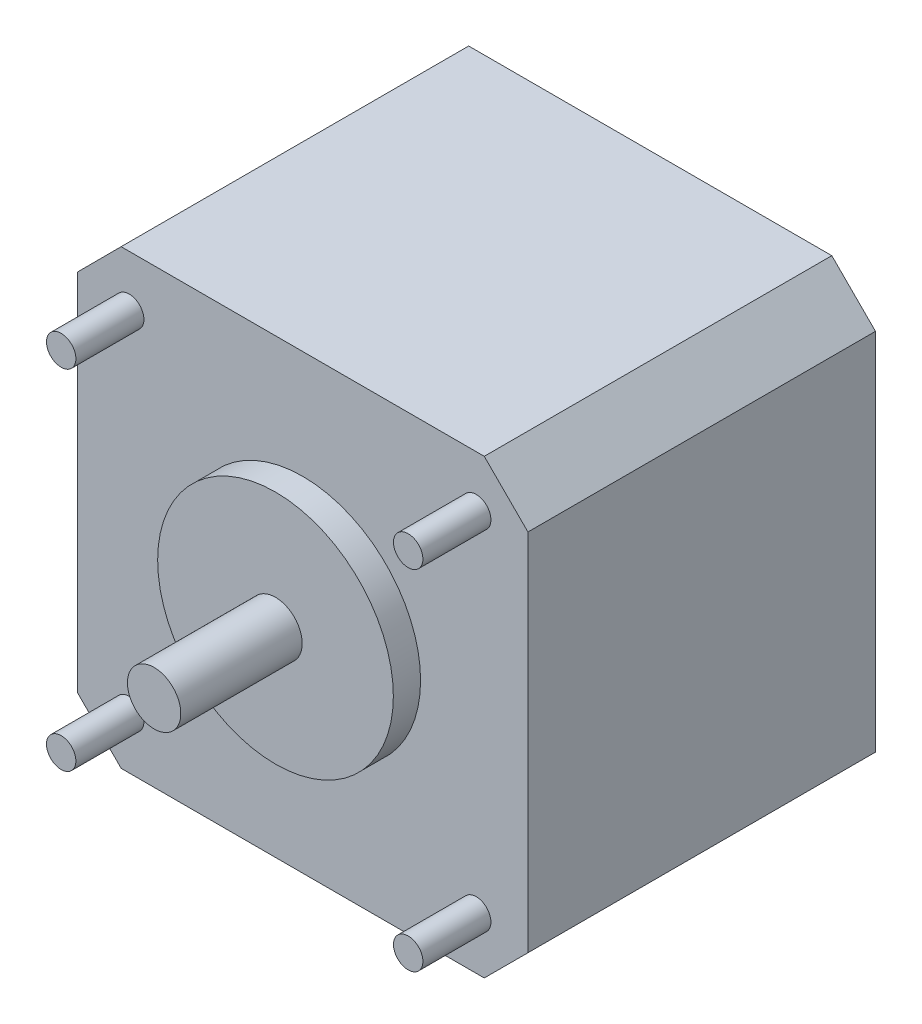
ISO-10303-21;
HEADER;
FILE_DESCRIPTION(('STEP AP214'),'2;1');
FILE_NAME('part.step','',(''),(''),'','','');
FILE_SCHEMA(('AUTOMOTIVE_DESIGN { 1 0 10303 214 1 1 1 1 }'));
ENDSEC;
DATA;
#1=APPLICATION_CONTEXT('core data for automotive mechanical design processes');
#2=APPLICATION_PROTOCOL_DEFINITION('international standard','automotive_design',2000,#1);
#3=PRODUCT_CONTEXT('',#1,'mechanical');
#4=PRODUCT('Part','Part','',(#3));
#5=PRODUCT_RELATED_PRODUCT_CATEGORY('part','',(#4));
#6=PRODUCT_DEFINITION_FORMATION('','',#4);
#7=PRODUCT_DEFINITION_CONTEXT('part definition',#1,'design');
#8=PRODUCT_DEFINITION('design','',#6,#7);
#9=PRODUCT_DEFINITION_SHAPE('','',#8);
#10=(LENGTH_UNIT() NAMED_UNIT(*) SI_UNIT(.MILLI.,.METRE.));
#11=(NAMED_UNIT(*) PLANE_ANGLE_UNIT() SI_UNIT($,.RADIAN.));
#12=(NAMED_UNIT(*) SI_UNIT($,.STERADIAN.) SOLID_ANGLE_UNIT());
#13=UNCERTAINTY_MEASURE_WITH_UNIT(LENGTH_MEASURE(1.E-05),#10,'distance_accuracy_value','');
#14=(GEOMETRIC_REPRESENTATION_CONTEXT(3) GLOBAL_UNCERTAINTY_ASSIGNED_CONTEXT((#13)) GLOBAL_UNIT_ASSIGNED_CONTEXT((#10,
#11,#12)) REPRESENTATION_CONTEXT('',''));
#15=CARTESIAN_POINT('',(0.,0.,0.));
#16=DIRECTION('',(0.,0.,1.));
#17=DIRECTION('',(1.,0.,0.));
#18=AXIS2_PLACEMENT_3D('',#15,#16,#17);
#19=CARTESIAN_POINT('',(0.,0.,0.));
#20=DIRECTION('',(0.,0.,1.));
#21=DIRECTION('',(1.,0.,0.));
#22=AXIS2_PLACEMENT_3D('',#19,#20,#21);
#23=PLANE('',#22);
#24=DIRECTION('',(0.707106781186546,-0.707106781186549,0.));
#25=VECTOR('',#24,1.);
#26=CARTESIAN_POINT('',(40.0619818605174,40.0619818605172,0.));
#27=LINE('',#26,#25);
#28=CARTESIAN_POINT('',(37.9599637210346,42.164,0.));
#29=VERTEX_POINT('',#28);
#30=CARTESIAN_POINT('',(42.037,38.0869637210346,0.));
#31=VERTEX_POINT('',#30);
#32=EDGE_CURVE('E128',#29,#31,#27,.T.);
#33=ORIENTED_EDGE('',*,*,#32,.T.);
#34=DIRECTION('',(0.,1.,0.));
#35=VECTOR('',#34,1.);
#36=CARTESIAN_POINT('',(42.037,0.,0.));
#37=LINE('',#36,#35);
#38=CARTESIAN_POINT('',(42.037,4.07703627896541,0.));
#39=VERTEX_POINT('',#38);
#40=EDGE_CURVE('E146',#39,#31,#37,.T.);
#41=ORIENTED_EDGE('',*,*,#40,.F.);
#42=DIRECTION('',(0.707106781186546,0.707106781186549,0.));
#43=VECTOR('',#42,1.);
#44=CARTESIAN_POINT('',(18.9799818605174,-18.9799818605173,0.));
#45=LINE('',#44,#43);
#46=CARTESIAN_POINT('',(37.9599637210346,0.,0.));
#47=VERTEX_POINT('',#46);
#48=EDGE_CURVE('E79',#47,#39,#45,.T.);
#49=ORIENTED_EDGE('',*,*,#48,.F.);
#50=DIRECTION('',(1.,0.,0.));
#51=VECTOR('',#50,1.);
#52=CARTESIAN_POINT('',(0.,0.,0.));
#53=LINE('',#52,#51);
#54=CARTESIAN_POINT('',(4.07703627896542,0.,0.));
#55=VERTEX_POINT('',#54);
#56=EDGE_CURVE('E119',#55,#47,#53,.T.);
#57=ORIENTED_EDGE('',*,*,#56,.F.);
#58=DIRECTION('',(-0.707106781186551,0.707106781186544,0.));
#59=VECTOR('',#58,1.);
#60=CARTESIAN_POINT('',(2.03851813948269,2.03851813948271,0.));
#61=LINE('',#60,#59);
#62=CARTESIAN_POINT('',(0.,4.07703627896537,0.));
#63=VERTEX_POINT('',#62);
#64=EDGE_CURVE('E141',#55,#63,#61,.T.);
#65=ORIENTED_EDGE('',*,*,#64,.T.);
#66=DIRECTION('',(0.,1.,0.));
#67=VECTOR('',#66,1.);
#68=CARTESIAN_POINT('',(0.,0.,0.));
#69=LINE('',#68,#67);
#70=CARTESIAN_POINT('',(0.,38.0808189895735,0.));
#71=VERTEX_POINT('',#70);
#72=EDGE_CURVE('E138',#63,#71,#69,.T.);
#73=ORIENTED_EDGE('',*,*,#72,.T.);
#74=DIRECTION('',(0.70603945201763,0.708172501721611,0.));
#75=VECTOR('',#74,1.);
#76=CARTESIAN_POINT('',(-19.0403228628078,18.9829724927391,0.));
#77=LINE('',#76,#75);
#78=CARTESIAN_POINT('',(4.07088227244324,42.164,0.));
#79=VERTEX_POINT('',#78);
#80=EDGE_CURVE('E135',#71,#79,#77,.T.);
#81=ORIENTED_EDGE('',*,*,#80,.T.);
#82=DIRECTION('',(1.,0.,0.));
#83=VECTOR('',#82,1.);
#84=CARTESIAN_POINT('',(0.,42.164,0.));
#85=LINE('',#84,#83);
#86=EDGE_CURVE('E131',#79,#29,#85,.T.);
#87=ORIENTED_EDGE('',*,*,#86,.T.);
#88=EDGE_LOOP('',(#33,#41,#49,#57,#65,#73,#81,#87));
#89=FACE_BOUND('',#88,.T.);
#90=CARTESIAN_POINT('',(21.0185,21.0789276342695,0.));
#91=DIRECTION('',(0.,0.,1.));
#92=DIRECTION('',(1.,0.,0.));
#93=AXIS2_PLACEMENT_3D('',#90,#91,#92);
#94=CIRCLE('',#93,2.4892);
#95=CARTESIAN_POINT('',(23.5077,21.0789276342695,0.));
#96=VERTEX_POINT('',#95);
#97=EDGE_CURVE('E11',#96,#96,#94,.F.);
#98=ORIENTED_EDGE('',*,*,#97,.F.);
#99=EDGE_LOOP('',(#98));
#100=FACE_BOUND('',#99,.T.);
#101=ADVANCED_FACE('F33',(#89,#100),#23,.F.);
#102=CARTESIAN_POINT('',(0.,0.,32.4358));
#103=DIRECTION('',(0.,0.,1.));
#104=DIRECTION('',(1.,0.,0.));
#105=AXIS2_PLACEMENT_3D('',#102,#103,#104);
#106=PLANE('',#105);
#107=CARTESIAN_POINT('',(37.211,4.826,32.4358));
#108=DIRECTION('',(0.,0.,1.));
#109=DIRECTION('',(1.,0.,0.));
#110=AXIS2_PLACEMENT_3D('',#107,#108,#109);
#111=CIRCLE('',#110,1.3716);
#112=CARTESIAN_POINT('',(38.5826,4.826,32.4358));
#113=VERTEX_POINT('',#112);
#114=EDGE_CURVE('E269',#113,#113,#111,.T.);
#115=ORIENTED_EDGE('',*,*,#114,.F.);
#116=EDGE_LOOP('',(#115));
#117=FACE_BOUND('',#116,.T.);
#118=CARTESIAN_POINT('',(4.826,37.338,32.4358));
#119=DIRECTION('',(0.,0.,1.));
#120=DIRECTION('',(1.,0.,0.));
#121=AXIS2_PLACEMENT_3D('',#118,#119,#120);
#122=CIRCLE('',#121,1.3716);
#123=CARTESIAN_POINT('',(6.1976,37.338,32.4358));
#124=VERTEX_POINT('',#123);
#125=EDGE_CURVE('E280',#124,#124,#122,.T.);
#126=ORIENTED_EDGE('',*,*,#125,.F.);
#127=EDGE_LOOP('',(#126));
#128=FACE_BOUND('',#127,.T.);
#129=DIRECTION('',(0.707106781186546,-0.707106781186549,0.));
#130=VECTOR('',#129,1.);
#131=CARTESIAN_POINT('',(40.0619818605174,40.0619818605172,32.4358));
#132=LINE('',#131,#130);
#133=CARTESIAN_POINT('',(37.9599637210346,42.164,32.4358));
#134=VERTEX_POINT('',#133);
#135=CARTESIAN_POINT('',(42.037,38.0869637210346,32.4358));
#136=VERTEX_POINT('',#135);
#137=EDGE_CURVE('E148',#134,#136,#132,.T.);
#138=ORIENTED_EDGE('',*,*,#137,.F.);
#139=DIRECTION('',(1.,0.,0.));
#140=VECTOR('',#139,1.);
#141=CARTESIAN_POINT('',(0.,42.164,32.4358));
#142=LINE('',#141,#140);
#143=CARTESIAN_POINT('',(4.07088227244324,42.164,32.4358));
#144=VERTEX_POINT('',#143);
#145=EDGE_CURVE('E162',#144,#134,#142,.T.);
#146=ORIENTED_EDGE('',*,*,#145,.F.);
#147=DIRECTION('',(0.70603945201763,0.708172501721611,0.));
#148=VECTOR('',#147,1.);
#149=CARTESIAN_POINT('',(-19.0403228628078,18.9829724927391,32.4358));
#150=LINE('',#149,#148);
#151=CARTESIAN_POINT('',(0.,38.0808189895735,32.4358));
#152=VERTEX_POINT('',#151);
#153=EDGE_CURVE('E172',#152,#144,#150,.T.);
#154=ORIENTED_EDGE('',*,*,#153,.F.);
#155=DIRECTION('',(0.,1.,0.));
#156=VECTOR('',#155,1.);
#157=CARTESIAN_POINT('',(0.,0.,32.4358));
#158=LINE('',#157,#156);
#159=CARTESIAN_POINT('',(0.,4.07703627896537,32.4358));
#160=VERTEX_POINT('',#159);
#161=EDGE_CURVE('E175',#160,#152,#158,.T.);
#162=ORIENTED_EDGE('',*,*,#161,.F.);
#163=DIRECTION('',(-0.707106781186551,0.707106781186544,0.));
#164=VECTOR('',#163,1.);
#165=CARTESIAN_POINT('',(2.03851813948269,2.03851813948271,32.4358));
#166=LINE('',#165,#164);
#167=CARTESIAN_POINT('',(4.07703627896542,0.,32.4358));
#168=VERTEX_POINT('',#167);
#169=EDGE_CURVE('E113',#168,#160,#166,.T.);
#170=ORIENTED_EDGE('',*,*,#169,.F.);
#171=DIRECTION('',(1.,0.,0.));
#172=VECTOR('',#171,1.);
#173=CARTESIAN_POINT('',(0.,0.,32.4358));
#174=LINE('',#173,#172);
#175=CARTESIAN_POINT('',(37.9599637210346,0.,32.4358));
#176=VERTEX_POINT('',#175);
#177=EDGE_CURVE('E105',#168,#176,#174,.T.);
#178=ORIENTED_EDGE('',*,*,#177,.T.);
#179=DIRECTION('',(0.707106781186546,0.707106781186549,0.));
#180=VECTOR('',#179,1.);
#181=CARTESIAN_POINT('',(18.9799818605174,-18.9799818605173,32.4358));
#182=LINE('',#181,#180);
#183=CARTESIAN_POINT('',(42.037,4.07703627896541,32.4358));
#184=VERTEX_POINT('',#183);
#185=EDGE_CURVE('E110',#176,#184,#182,.T.);
#186=ORIENTED_EDGE('',*,*,#185,.T.);
#187=DIRECTION('',(0.,1.,0.));
#188=VECTOR('',#187,1.);
#189=CARTESIAN_POINT('',(42.037,0.,32.4358));
#190=LINE('',#189,#188);
#191=EDGE_CURVE('E50',#184,#136,#190,.T.);
#192=ORIENTED_EDGE('',*,*,#191,.T.);
#193=EDGE_LOOP('',(#138,#146,#154,#162,#170,#178,#186,#192));
#194=FACE_BOUND('',#193,.T.);
#195=CARTESIAN_POINT('',(21.0185,21.0789276342695,32.4358));
#196=DIRECTION('',(0.,0.,1.));
#197=DIRECTION('',(1.,0.,0.));
#198=AXIS2_PLACEMENT_3D('',#195,#196,#197);
#199=CIRCLE('',#198,10.9982);
#200=CARTESIAN_POINT('',(32.0167,21.0789276342695,32.4358));
#201=VERTEX_POINT('',#200);
#202=EDGE_CURVE('E292',#201,#201,#199,.T.);
#203=ORIENTED_EDGE('',*,*,#202,.F.);
#204=EDGE_LOOP('',(#203));
#205=FACE_BOUND('',#204,.T.);
#206=CARTESIAN_POINT('',(4.826,4.826,32.4358));
#207=DIRECTION('',(0.,0.,1.));
#208=DIRECTION('',(1.,0.,0.));
#209=AXIS2_PLACEMENT_3D('',#206,#207,#208);
#210=CIRCLE('',#209,1.3716);
#211=CARTESIAN_POINT('',(6.1976,4.826,32.4358));
#212=VERTEX_POINT('',#211);
#213=EDGE_CURVE('E274',#212,#212,#210,.T.);
#214=ORIENTED_EDGE('',*,*,#213,.F.);
#215=EDGE_LOOP('',(#214));
#216=FACE_BOUND('',#215,.T.);
#217=CARTESIAN_POINT('',(37.211,37.338,32.4358));
#218=DIRECTION('',(0.,0.,1.));
#219=DIRECTION('',(1.,0.,0.));
#220=AXIS2_PLACEMENT_3D('',#217,#218,#219);
#221=CIRCLE('',#220,1.3716);
#222=CARTESIAN_POINT('',(38.5826,37.338,32.4358));
#223=VERTEX_POINT('',#222);
#224=EDGE_CURVE('E262',#223,#223,#221,.T.);
#225=ORIENTED_EDGE('',*,*,#224,.F.);
#226=EDGE_LOOP('',(#225));
#227=FACE_BOUND('',#226,.T.);
#228=ADVANCED_FACE('F107',(#117,#128,#194,#205,#216,#227),#106,.T.);
#229=CARTESIAN_POINT('',(21.0185,21.0789276342695,34.9758));
#230=DIRECTION('',(0.,0.,1.));
#231=DIRECTION('',(1.,0.,0.));
#232=AXIS2_PLACEMENT_3D('',#229,#230,#231);
#233=PLANE('',#232);
#234=CARTESIAN_POINT('',(21.0185,21.0789276342695,34.9758));
#235=DIRECTION('',(0.,0.,1.));
#236=DIRECTION('',(1.,0.,0.));
#237=AXIS2_PLACEMENT_3D('',#234,#235,#236);
#238=CIRCLE('',#237,10.9982);
#239=CARTESIAN_POINT('',(32.0167,21.0789276342695,34.9758));
#240=VERTEX_POINT('',#239);
#241=EDGE_CURVE('E132',#240,#240,#238,.T.);
#242=ORIENTED_EDGE('',*,*,#241,.T.);
#243=EDGE_LOOP('',(#242));
#244=FACE_BOUND('',#243,.T.);
#245=CARTESIAN_POINT('',(21.0185,21.0789276342695,34.9758));
#246=DIRECTION('',(0.,0.,1.));
#247=DIRECTION('',(1.,0.,0.));
#248=AXIS2_PLACEMENT_3D('',#245,#246,#247);
#249=CIRCLE('',#248,2.4892);
#250=CARTESIAN_POINT('',(18.5293,21.0789276342695,34.9758));
#251=VERTEX_POINT('',#250);
#252=EDGE_CURVE('E286',#251,#251,#249,.T.);
#253=ORIENTED_EDGE('',*,*,#252,.F.);
#254=EDGE_LOOP('',(#253));
#255=FACE_BOUND('',#254,.T.);
#256=ADVANCED_FACE('F204',(#244,#255),#233,.T.);
#257=CARTESIAN_POINT('',(40.0619818605174,40.0619818605172,32.4358));
#258=DIRECTION('',(0.707106781186549,0.707106781186546,0.));
#259=DIRECTION('',(-0.707106781186546,0.707106781186549,0.));
#260=AXIS2_PLACEMENT_3D('',#257,#258,#259);
#261=PLANE('',#260);
#262=ORIENTED_EDGE('',*,*,#32,.F.);
#263=DIRECTION('',(0.,0.,-1.));
#264=VECTOR('',#263,1.);
#265=CARTESIAN_POINT('',(37.9599637210346,42.164,32.4358));
#266=LINE('',#265,#264);
#267=EDGE_CURVE('E42',#134,#29,#266,.T.);
#268=ORIENTED_EDGE('',*,*,#267,.F.);
#269=ORIENTED_EDGE('',*,*,#137,.T.);
#270=DIRECTION('',(0.,0.,-1.));
#271=VECTOR('',#270,1.);
#272=CARTESIAN_POINT('',(42.037,38.0869637210346,32.4358));
#273=LINE('',#272,#271);
#274=EDGE_CURVE('E86',#136,#31,#273,.T.);
#275=ORIENTED_EDGE('',*,*,#274,.T.);
#276=EDGE_LOOP('',(#262,#268,#269,#275));
#277=FACE_BOUND('',#276,.T.);
#278=ADVANCED_FACE('F35',(#277),#261,.T.);
#279=CARTESIAN_POINT('',(0.,42.164,32.4358));
#280=DIRECTION('',(0.,1.,0.));
#281=DIRECTION('',(0.,0.,1.));
#282=AXIS2_PLACEMENT_3D('',#279,#280,#281);
#283=PLANE('',#282);
#284=ORIENTED_EDGE('',*,*,#86,.F.);
#285=DIRECTION('',(0.,0.,-1.));
#286=VECTOR('',#285,1.);
#287=CARTESIAN_POINT('',(4.07088227244324,42.164,32.4358));
#288=LINE('',#287,#286);
#289=EDGE_CURVE('E156',#144,#79,#288,.T.);
#290=ORIENTED_EDGE('',*,*,#289,.F.);
#291=ORIENTED_EDGE('',*,*,#145,.T.);
#292=ORIENTED_EDGE('',*,*,#267,.T.);
#293=EDGE_LOOP('',(#284,#290,#291,#292));
#294=FACE_BOUND('',#293,.T.);
#295=ADVANCED_FACE('F160',(#294),#283,.T.);
#296=CARTESIAN_POINT('',(-19.0403228628078,18.9829724927391,32.4358));
#297=DIRECTION('',(-0.708172501721611,0.70603945201763,0.));
#298=DIRECTION('',(-0.70603945201763,-0.708172501721611,0.));
#299=AXIS2_PLACEMENT_3D('',#296,#297,#298);
#300=PLANE('',#299);
#301=ORIENTED_EDGE('',*,*,#80,.F.);
#302=DIRECTION('',(0.,0.,-1.));
#303=VECTOR('',#302,1.);
#304=CARTESIAN_POINT('',(0.,38.0808189895735,32.4358));
#305=LINE('',#304,#303);
#306=EDGE_CURVE('E154',#152,#71,#305,.T.);
#307=ORIENTED_EDGE('',*,*,#306,.F.);
#308=ORIENTED_EDGE('',*,*,#153,.T.);
#309=ORIENTED_EDGE('',*,*,#289,.T.);
#310=EDGE_LOOP('',(#301,#307,#308,#309));
#311=FACE_BOUND('',#310,.T.);
#312=ADVANCED_FACE('F169',(#311),#300,.T.);
#313=CARTESIAN_POINT('',(0.,0.,32.4358));
#314=DIRECTION('',(-1.,0.,0.));
#315=DIRECTION('',(0.,-1.,0.));
#316=AXIS2_PLACEMENT_3D('',#313,#314,#315);
#317=PLANE('',#316);
#318=ORIENTED_EDGE('',*,*,#72,.F.);
#319=DIRECTION('',(0.,0.,-1.));
#320=VECTOR('',#319,1.);
#321=CARTESIAN_POINT('',(0.,4.07703627896537,32.4358));
#322=LINE('',#321,#320);
#323=EDGE_CURVE('E152',#160,#63,#322,.T.);
#324=ORIENTED_EDGE('',*,*,#323,.F.);
#325=ORIENTED_EDGE('',*,*,#161,.T.);
#326=ORIENTED_EDGE('',*,*,#306,.T.);
#327=EDGE_LOOP('',(#318,#324,#325,#326));
#328=FACE_BOUND('',#327,.T.);
#329=ADVANCED_FACE('F428',(#328),#317,.T.);
#330=CARTESIAN_POINT('',(2.03851813948269,2.03851813948271,32.4358));
#331=DIRECTION('',(-0.707106781186544,-0.707106781186551,0.));
#332=DIRECTION('',(0.707106781186551,-0.707106781186544,0.));
#333=AXIS2_PLACEMENT_3D('',#330,#331,#332);
#334=PLANE('',#333);
#335=ORIENTED_EDGE('',*,*,#64,.F.);
#336=DIRECTION('',(0.,0.,-1.));
#337=VECTOR('',#336,1.);
#338=CARTESIAN_POINT('',(4.07703627896542,0.,32.4358));
#339=LINE('',#338,#337);
#340=EDGE_CURVE('E120',#168,#55,#339,.T.);
#341=ORIENTED_EDGE('',*,*,#340,.F.);
#342=ORIENTED_EDGE('',*,*,#169,.T.);
#343=ORIENTED_EDGE('',*,*,#323,.T.);
#344=EDGE_LOOP('',(#335,#341,#342,#343));
#345=FACE_BOUND('',#344,.T.);
#346=ADVANCED_FACE('F182',(#345),#334,.T.);
#347=CARTESIAN_POINT('',(0.,0.,32.4358));
#348=DIRECTION('',(0.,1.,0.));
#349=DIRECTION('',(0.,0.,1.));
#350=AXIS2_PLACEMENT_3D('',#347,#348,#349);
#351=PLANE('',#350);
#352=ORIENTED_EDGE('',*,*,#56,.T.);
#353=DIRECTION('',(0.,0.,-1.));
#354=VECTOR('',#353,1.);
#355=CARTESIAN_POINT('',(37.9599637210346,0.,32.4358));
#356=LINE('',#355,#354);
#357=EDGE_CURVE('E116',#176,#47,#356,.T.);
#358=ORIENTED_EDGE('',*,*,#357,.F.);
#359=ORIENTED_EDGE('',*,*,#177,.F.);
#360=ORIENTED_EDGE('',*,*,#340,.T.);
#361=EDGE_LOOP('',(#352,#358,#359,#360));
#362=FACE_BOUND('',#361,.T.);
#363=ADVANCED_FACE('F117',(#362),#351,.F.);
#364=CARTESIAN_POINT('',(18.9799818605174,-18.9799818605173,32.4358));
#365=DIRECTION('',(-0.707106781186549,0.707106781186546,0.));
#366=DIRECTION('',(-0.707106781186546,-0.707106781186549,0.));
#367=AXIS2_PLACEMENT_3D('',#364,#365,#366);
#368=PLANE('',#367);
#369=ORIENTED_EDGE('',*,*,#48,.T.);
#370=DIRECTION('',(0.,0.,-1.));
#371=VECTOR('',#370,1.);
#372=CARTESIAN_POINT('',(42.037,4.07703627896541,32.4358));
#373=LINE('',#372,#371);
#374=EDGE_CURVE('E121',#184,#39,#373,.T.);
#375=ORIENTED_EDGE('',*,*,#374,.F.);
#376=ORIENTED_EDGE('',*,*,#185,.F.);
#377=ORIENTED_EDGE('',*,*,#357,.T.);
#378=EDGE_LOOP('',(#369,#375,#376,#377));
#379=FACE_BOUND('',#378,.T.);
#380=ADVANCED_FACE('F123',(#379),#368,.F.);
#381=CARTESIAN_POINT('',(42.037,0.,32.4358));
#382=DIRECTION('',(-1.,0.,0.));
#383=DIRECTION('',(0.,-1.,0.));
#384=AXIS2_PLACEMENT_3D('',#381,#382,#383);
#385=PLANE('',#384);
#386=ORIENTED_EDGE('',*,*,#40,.T.);
#387=ORIENTED_EDGE('',*,*,#274,.F.);
#388=ORIENTED_EDGE('',*,*,#191,.F.);
#389=ORIENTED_EDGE('',*,*,#374,.T.);
#390=EDGE_LOOP('',(#386,#387,#388,#389));
#391=FACE_BOUND('',#390,.T.);
#392=ADVANCED_FACE('F184',(#391),#385,.F.);
#393=CARTESIAN_POINT('',(21.0185,21.0789276342695,34.9758));
#394=DIRECTION('',(0.,0.,-1.));
#395=DIRECTION('',(-1.,0.,0.));
#396=AXIS2_PLACEMENT_3D('',#393,#394,#395);
#397=CYLINDRICAL_SURFACE('',#396,10.9982);
#398=ORIENTED_EDGE('',*,*,#241,.F.);
#399=EDGE_LOOP('',(#398));
#400=FACE_BOUND('',#399,.T.);
#401=ORIENTED_EDGE('',*,*,#202,.T.);
#402=EDGE_LOOP('',(#401));
#403=FACE_BOUND('',#402,.T.);
#404=ADVANCED_FACE('F186',(#400,#403),#397,.T.);
#405=CARTESIAN_POINT('',(21.0185,21.0789276342695,46.3042));
#406=DIRECTION('',(0.,0.,-1.));
#407=DIRECTION('',(-1.,0.,0.));
#408=AXIS2_PLACEMENT_3D('',#405,#406,#407);
#409=CYLINDRICAL_SURFACE('',#408,2.4892);
#410=CARTESIAN_POINT('',(21.0185,21.0789276342695,46.3042));
#411=DIRECTION('',(0.,0.,1.));
#412=DIRECTION('',(1.,0.,0.));
#413=AXIS2_PLACEMENT_3D('',#410,#411,#412);
#414=CIRCLE('',#413,2.4892);
#415=CARTESIAN_POINT('',(18.5293,21.0789276342695,46.3042));
#416=VERTEX_POINT('',#415);
#417=EDGE_CURVE('E289',#416,#416,#414,.T.);
#418=CARTESIAN_POINT('',(18.5293,21.0789276342695,46.3042));
#419=CARTESIAN_POINT('',(18.5293,21.0789276342695,46.1861958333333));
#420=CARTESIAN_POINT('',(18.5293,21.0789276342695,46.0681916666667));
#421=CARTESIAN_POINT('',(18.5293,21.0789276342695,45.8321833333333));
#422=CARTESIAN_POINT('',(18.5293,21.0789276342695,45.7141791666667));
#423=CARTESIAN_POINT('',(18.5293,21.0789276342695,45.4781708333333));
#424=CARTESIAN_POINT('',(18.5293,21.0789276342695,45.3601666666667));
#425=CARTESIAN_POINT('',(18.5293,21.0789276342695,45.1241583333333));
#426=CARTESIAN_POINT('',(18.5293,21.0789276342695,45.0061541666667));
#427=CARTESIAN_POINT('',(18.5293,21.0789276342695,44.7701458333333));
#428=CARTESIAN_POINT('',(18.5293,21.0789276342695,44.6521416666667));
#429=CARTESIAN_POINT('',(18.5293,21.0789276342695,44.4161333333333));
#430=CARTESIAN_POINT('',(18.5293,21.0789276342695,44.2981291666667));
#431=CARTESIAN_POINT('',(18.5293,21.0789276342695,44.0621208333333));
#432=CARTESIAN_POINT('',(18.5293,21.0789276342695,43.9441166666667));
#433=CARTESIAN_POINT('',(18.5293,21.0789276342695,43.7081083333333));
#434=CARTESIAN_POINT('',(18.5293,21.0789276342695,43.5901041666667));
#435=CARTESIAN_POINT('',(18.5293,21.0789276342695,43.3540958333333));
#436=CARTESIAN_POINT('',(18.5293,21.0789276342695,43.2360916666667));
#437=CARTESIAN_POINT('',(18.5293,21.0789276342695,43.0000833333333));
#438=CARTESIAN_POINT('',(18.5293,21.0789276342695,42.8820791666667));
#439=CARTESIAN_POINT('',(18.5293,21.0789276342695,42.6460708333333));
#440=CARTESIAN_POINT('',(18.5293,21.0789276342695,42.5280666666667));
#441=CARTESIAN_POINT('',(18.5293,21.0789276342695,42.2920583333333));
#442=CARTESIAN_POINT('',(18.5293,21.0789276342695,42.1740541666667));
#443=CARTESIAN_POINT('',(18.5293,21.0789276342695,41.9380458333333));
#444=CARTESIAN_POINT('',(18.5293,21.0789276342695,41.8200416666667));
#445=CARTESIAN_POINT('',(18.5293,21.0789276342695,41.5840333333333));
#446=CARTESIAN_POINT('',(18.5293,21.0789276342695,41.4660291666667));
#447=CARTESIAN_POINT('',(18.5293,21.0789276342695,41.2300208333333));
#448=CARTESIAN_POINT('',(18.5293,21.0789276342695,41.1120166666667));
#449=CARTESIAN_POINT('',(18.5293,21.0789276342695,40.8760083333333));
#450=CARTESIAN_POINT('',(18.5293,21.0789276342695,40.7580041666667));
#451=CARTESIAN_POINT('',(18.5293,21.0789276342695,40.5219958333333));
#452=CARTESIAN_POINT('',(18.5293,21.0789276342695,40.4039916666667));
#453=CARTESIAN_POINT('',(18.5293,21.0789276342695,40.1679833333333));
#454=CARTESIAN_POINT('',(18.5293,21.0789276342695,40.0499791666667));
#455=CARTESIAN_POINT('',(18.5293,21.0789276342695,39.8139708333333));
#456=CARTESIAN_POINT('',(18.5293,21.0789276342695,39.6959666666667));
#457=CARTESIAN_POINT('',(18.5293,21.0789276342695,39.4599583333333));
#458=CARTESIAN_POINT('',(18.5293,21.0789276342695,39.3419541666667));
#459=CARTESIAN_POINT('',(18.5293,21.0789276342695,39.1059458333333));
#460=CARTESIAN_POINT('',(18.5293,21.0789276342695,38.9879416666667));
#461=CARTESIAN_POINT('',(18.5293,21.0789276342695,38.7519333333333));
#462=CARTESIAN_POINT('',(18.5293,21.0789276342695,38.6339291666667));
#463=CARTESIAN_POINT('',(18.5293,21.0789276342695,38.3979208333333));
#464=CARTESIAN_POINT('',(18.5293,21.0789276342695,38.2799166666667));
#465=CARTESIAN_POINT('',(18.5293,21.0789276342695,38.0439083333333));
#466=CARTESIAN_POINT('',(18.5293,21.0789276342695,37.9259041666667));
#467=CARTESIAN_POINT('',(18.5293,21.0789276342695,37.6898958333333));
#468=CARTESIAN_POINT('',(18.5293,21.0789276342695,37.5718916666667));
#469=CARTESIAN_POINT('',(18.5293,21.0789276342695,37.3358833333333));
#470=CARTESIAN_POINT('',(18.5293,21.0789276342695,37.2178791666667));
#471=CARTESIAN_POINT('',(18.5293,21.0789276342695,36.9818708333333));
#472=CARTESIAN_POINT('',(18.5293,21.0789276342695,36.8638666666667));
#473=CARTESIAN_POINT('',(18.5293,21.0789276342695,36.6278583333333));
#474=CARTESIAN_POINT('',(18.5293,21.0789276342695,36.5098541666667));
#475=CARTESIAN_POINT('',(18.5293,21.0789276342695,36.2738458333333));
#476=CARTESIAN_POINT('',(18.5293,21.0789276342695,36.1558416666667));
#477=CARTESIAN_POINT('',(18.5293,21.0789276342695,35.9198333333333));
#478=CARTESIAN_POINT('',(18.5293,21.0789276342695,35.8018291666667));
#479=CARTESIAN_POINT('',(18.5293,21.0789276342695,35.5658208333333));
#480=CARTESIAN_POINT('',(18.5293,21.0789276342695,35.4478166666667));
#481=CARTESIAN_POINT('',(18.5293,21.0789276342695,35.2118083333333));
#482=CARTESIAN_POINT('',(18.5293,21.0789276342695,35.0938041666667));
#483=CARTESIAN_POINT('',(18.5293,21.0789276342695,34.9758));
#484=B_SPLINE_CURVE_WITH_KNOTS('',3,(#418,#419,#420,#421,#422,#423,#424,#425,#426,#427,#428,
#429,#430,#431,#432,#433,#434,#435,#436,#437,#438,#439,#440,#441,#442,#443,#444,#445,#446,#447,
#448,#449,#450,#451,#452,#453,#454,#455,#456,#457,#458,#459,#460,#461,#462,#463,#464,#465,#466,
#467,#468,#469,#470,#471,#472,#473,#474,#475,#476,#477,#478,#479,#480,#481,#482,#483),
.UNSPECIFIED.,.F.,.F.,(4,2,2,2,2,2,2,2,2,2,2,2,2,2,2,2,2,2,2,2,2,2,2,2,2,2,2,2,2,2,2,2,4),(0.,
0.354012500000001,0.708025000000001,1.0620375,1.41605,1.7700625,2.124075,2.4780875,2.8321,
3.1861125,3.54012500000001,3.89413750000001,4.24815000000001,4.60216250000001,4.956175,
5.3101875,5.6642,6.0182125,6.372225,6.7262375,7.08025,7.4342625,7.788275,8.14228750000001,
8.49630000000001,8.85031250000001,9.20432500000001,9.55833750000001,9.91235000000001,10.2663625,
10.620375,10.9743875,11.3284),.UNSPECIFIED.);
#485=EDGE_CURVE('BSEAM193',#416,#251,#484,.T.);
#486=ORIENTED_EDGE('',*,*,#417,.F.);
#487=ORIENTED_EDGE('',*,*,#252,.T.);
#488=ORIENTED_EDGE('',*,*,#485,.T.);
#489=ORIENTED_EDGE('',*,*,#485,.F.);
#490=EDGE_LOOP('',(#486,#488,#487,#489));
#491=FACE_BOUND('',#490,.T.);
#492=ADVANCED_FACE('F193',(#491),#409,.T.);
#493=CARTESIAN_POINT('',(21.0185,21.0789276342695,46.3042));
#494=DIRECTION('',(0.,0.,1.));
#495=DIRECTION('',(1.,0.,0.));
#496=AXIS2_PLACEMENT_3D('',#493,#494,#495);
#497=PLANE('',#496);
#498=ORIENTED_EDGE('',*,*,#417,.T.);
#499=EDGE_LOOP('',(#498));
#500=FACE_BOUND('',#499,.T.);
#501=ADVANCED_FACE('F213',(#500),#497,.T.);
#502=CARTESIAN_POINT('',(4.826,37.338,38.7858));
#503=DIRECTION('',(0.,0.,-1.));
#504=DIRECTION('',(-1.,0.,0.));
#505=AXIS2_PLACEMENT_3D('',#502,#503,#504);
#506=CYLINDRICAL_SURFACE('',#505,1.3716);
#507=CARTESIAN_POINT('',(4.826,37.338,38.7858));
#508=DIRECTION('',(0.,0.,1.));
#509=DIRECTION('',(1.,0.,0.));
#510=AXIS2_PLACEMENT_3D('',#507,#508,#509);
#511=CIRCLE('',#510,1.3716);
#512=CARTESIAN_POINT('',(6.1976,37.338,38.7858));
#513=VERTEX_POINT('',#512);
#514=EDGE_CURVE('E283',#513,#513,#511,.T.);
#515=ORIENTED_EDGE('',*,*,#514,.F.);
#516=EDGE_LOOP('',(#515));
#517=FACE_BOUND('',#516,.T.);
#518=ORIENTED_EDGE('',*,*,#125,.T.);
#519=EDGE_LOOP('',(#518));
#520=FACE_BOUND('',#519,.T.);
#521=ADVANCED_FACE('F217',(#517,#520),#506,.T.);
#522=CARTESIAN_POINT('',(4.826,37.338,38.7858));
#523=DIRECTION('',(0.,0.,1.));
#524=DIRECTION('',(1.,0.,0.));
#525=AXIS2_PLACEMENT_3D('',#522,#523,#524);
#526=PLANE('',#525);
#527=ORIENTED_EDGE('',*,*,#514,.T.);
#528=EDGE_LOOP('',(#527));
#529=FACE_BOUND('',#528,.T.);
#530=ADVANCED_FACE('F221',(#529),#526,.T.);
#531=CARTESIAN_POINT('',(4.826,4.826,38.7858));
#532=DIRECTION('',(0.,0.,-1.));
#533=DIRECTION('',(-1.,0.,0.));
#534=AXIS2_PLACEMENT_3D('',#531,#532,#533);
#535=CYLINDRICAL_SURFACE('',#534,1.3716);
#536=CARTESIAN_POINT('',(4.826,4.826,38.7858));
#537=DIRECTION('',(0.,0.,1.));
#538=DIRECTION('',(1.,0.,0.));
#539=AXIS2_PLACEMENT_3D('',#536,#537,#538);
#540=CIRCLE('',#539,1.3716);
#541=CARTESIAN_POINT('',(6.1976,4.826,38.7858));
#542=VERTEX_POINT('',#541);
#543=EDGE_CURVE('E277',#542,#542,#540,.T.);
#544=ORIENTED_EDGE('',*,*,#543,.F.);
#545=EDGE_LOOP('',(#544));
#546=FACE_BOUND('',#545,.T.);
#547=ORIENTED_EDGE('',*,*,#213,.T.);
#548=EDGE_LOOP('',(#547));
#549=FACE_BOUND('',#548,.T.);
#550=ADVANCED_FACE('F225',(#546,#549),#535,.T.);
#551=CARTESIAN_POINT('',(4.826,4.826,38.7858));
#552=DIRECTION('',(0.,0.,1.));
#553=DIRECTION('',(1.,0.,0.));
#554=AXIS2_PLACEMENT_3D('',#551,#552,#553);
#555=PLANE('',#554);
#556=ORIENTED_EDGE('',*,*,#543,.T.);
#557=EDGE_LOOP('',(#556));
#558=FACE_BOUND('',#557,.T.);
#559=ADVANCED_FACE('F229',(#558),#555,.T.);
#560=CARTESIAN_POINT('',(37.211,4.826,38.7858));
#561=DIRECTION('',(0.,0.,-1.));
#562=DIRECTION('',(-1.,0.,0.));
#563=AXIS2_PLACEMENT_3D('',#560,#561,#562);
#564=CYLINDRICAL_SURFACE('',#563,1.3716);
#565=CARTESIAN_POINT('',(37.211,4.826,38.7858));
#566=DIRECTION('',(0.,0.,1.));
#567=DIRECTION('',(1.,0.,0.));
#568=AXIS2_PLACEMENT_3D('',#565,#566,#567);
#569=CIRCLE('',#568,1.3716);
#570=CARTESIAN_POINT('',(38.5826,4.826,38.7858));
#571=VERTEX_POINT('',#570);
#572=EDGE_CURVE('E271',#571,#571,#569,.T.);
#573=ORIENTED_EDGE('',*,*,#572,.F.);
#574=EDGE_LOOP('',(#573));
#575=FACE_BOUND('',#574,.T.);
#576=ORIENTED_EDGE('',*,*,#114,.T.);
#577=EDGE_LOOP('',(#576));
#578=FACE_BOUND('',#577,.T.);
#579=ADVANCED_FACE('F233',(#575,#578),#564,.T.);
#580=CARTESIAN_POINT('',(37.211,4.826,38.7858));
#581=DIRECTION('',(0.,0.,1.));
#582=DIRECTION('',(1.,0.,0.));
#583=AXIS2_PLACEMENT_3D('',#580,#581,#582);
#584=PLANE('',#583);
#585=ORIENTED_EDGE('',*,*,#572,.T.);
#586=EDGE_LOOP('',(#585));
#587=FACE_BOUND('',#586,.T.);
#588=ADVANCED_FACE('F237',(#587),#584,.T.);
#589=CARTESIAN_POINT('',(37.211,37.338,38.7858));
#590=DIRECTION('',(0.,0.,-1.));
#591=DIRECTION('',(-1.,0.,0.));
#592=AXIS2_PLACEMENT_3D('',#589,#590,#591);
#593=CYLINDRICAL_SURFACE('',#592,1.3716);
#594=CARTESIAN_POINT('',(37.211,37.338,38.7858));
#595=DIRECTION('',(0.,0.,1.));
#596=DIRECTION('',(1.,0.,0.));
#597=AXIS2_PLACEMENT_3D('',#594,#595,#596);
#598=CIRCLE('',#597,1.3716);
#599=CARTESIAN_POINT('',(38.5826,37.338,38.7858));
#600=VERTEX_POINT('',#599);
#601=EDGE_CURVE('E265',#600,#600,#598,.T.);
#602=ORIENTED_EDGE('',*,*,#601,.F.);
#603=EDGE_LOOP('',(#602));
#604=FACE_BOUND('',#603,.T.);
#605=ORIENTED_EDGE('',*,*,#224,.T.);
#606=EDGE_LOOP('',(#605));
#607=FACE_BOUND('',#606,.T.);
#608=ADVANCED_FACE('F241',(#604,#607),#593,.T.);
#609=CARTESIAN_POINT('',(37.211,37.338,38.7858));
#610=DIRECTION('',(0.,0.,1.));
#611=DIRECTION('',(1.,0.,0.));
#612=AXIS2_PLACEMENT_3D('',#609,#610,#611);
#613=PLANE('',#612);
#614=ORIENTED_EDGE('',*,*,#601,.T.);
#615=EDGE_LOOP('',(#614));
#616=FACE_BOUND('',#615,.T.);
#617=ADVANCED_FACE('F245',(#616),#613,.T.);
#618=CARTESIAN_POINT('',(21.0185,21.0789276342695,-0.9144));
#619=DIRECTION('',(0.,0.,1.));
#620=DIRECTION('',(1.,0.,0.));
#621=AXIS2_PLACEMENT_3D('',#618,#619,#620);
#622=CYLINDRICAL_SURFACE('',#621,2.4892);
#623=CARTESIAN_POINT('',(21.0185,21.0789276342695,-0.9144));
#624=DIRECTION('',(0.,0.,-1.));
#625=DIRECTION('',(-1.,0.,0.));
#626=AXIS2_PLACEMENT_3D('',#623,#624,#625);
#627=CIRCLE('',#626,2.4892);
#628=CARTESIAN_POINT('',(18.5293,21.0789276342695,-0.9144));
#629=VERTEX_POINT('',#628);
#630=EDGE_CURVE('E261',#629,#629,#627,.T.);
#631=ORIENTED_EDGE('',*,*,#630,.F.);
#632=EDGE_LOOP('',(#631));
#633=FACE_BOUND('',#632,.T.);
#634=ORIENTED_EDGE('',*,*,#97,.T.);
#635=EDGE_LOOP('',(#634));
#636=FACE_BOUND('',#635,.T.);
#637=ADVANCED_FACE('F249',(#633,#636),#622,.T.);
#638=CARTESIAN_POINT('',(21.0185,21.0789276342695,-0.9144));
#639=DIRECTION('',(0.,0.,-1.));
#640=DIRECTION('',(-1.,0.,0.));
#641=AXIS2_PLACEMENT_3D('',#638,#639,#640);
#642=PLANE('',#641);
#643=ORIENTED_EDGE('',*,*,#630,.T.);
#644=EDGE_LOOP('',(#643));
#645=FACE_BOUND('',#644,.T.);
#646=ADVANCED_FACE('F253',(#645),#642,.T.);
#647=CLOSED_SHELL('',(#101,#228,#256,#278,#295,#312,#329,#346,#363,#380,#392,#404,#492,#501,
#521,#530,#550,#559,#579,#588,#608,#617,#637,#646));
#648=MANIFOLD_SOLID_BREP('B2',#647);
#649=ADVANCED_BREP_SHAPE_REPRESENTATION('',(#18,#648),#14);
#650=SHAPE_DEFINITION_REPRESENTATION(#9,#649);
ENDSEC;
END-ISO-10303-21;
